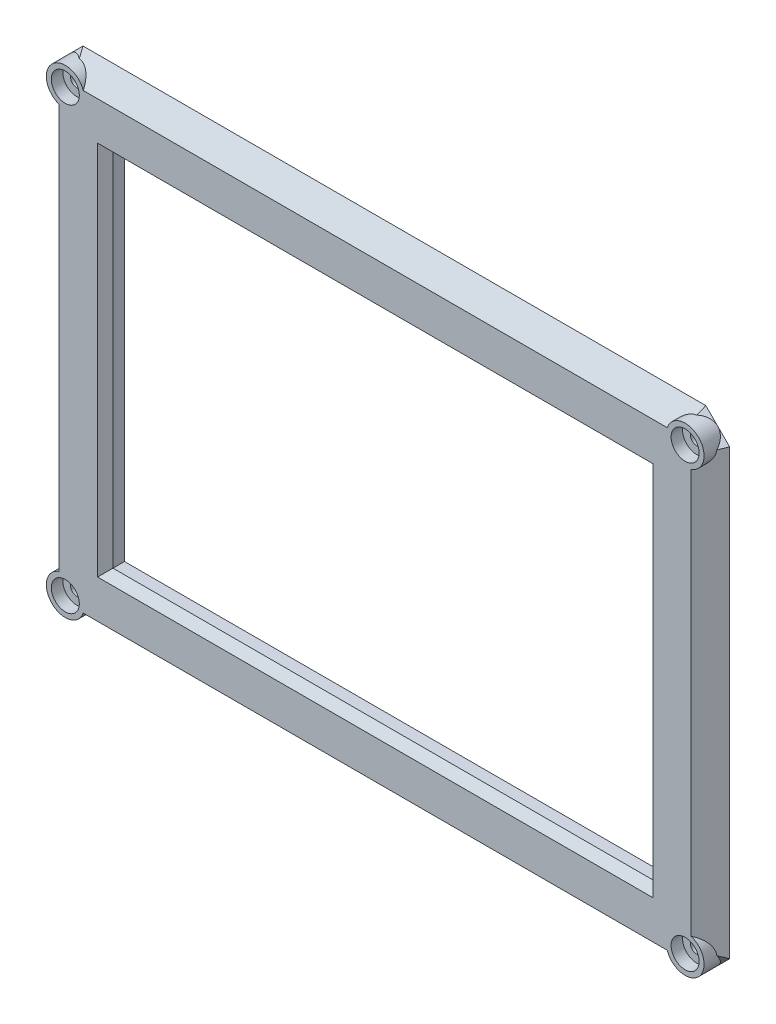
ISO-10303-21;
HEADER;
FILE_DESCRIPTION(('STEP AP214'),'2;1');
FILE_NAME('part.step','',(''),(''),'','','');
FILE_SCHEMA(('AUTOMOTIVE_DESIGN { 1 0 10303 214 1 1 1 1 }'));
ENDSEC;
DATA;
#1=APPLICATION_CONTEXT('core data for automotive mechanical design processes');
#2=APPLICATION_PROTOCOL_DEFINITION('international standard','automotive_design',2000,#1);
#3=PRODUCT_CONTEXT('',#1,'mechanical');
#4=PRODUCT('Part','Part','',(#3));
#5=PRODUCT_RELATED_PRODUCT_CATEGORY('part','',(#4));
#6=PRODUCT_DEFINITION_FORMATION('','',#4);
#7=PRODUCT_DEFINITION_CONTEXT('part definition',#1,'design');
#8=PRODUCT_DEFINITION('design','',#6,#7);
#9=PRODUCT_DEFINITION_SHAPE('','',#8);
#10=(LENGTH_UNIT() NAMED_UNIT(*) SI_UNIT(.MILLI.,.METRE.));
#11=(NAMED_UNIT(*) PLANE_ANGLE_UNIT() SI_UNIT($,.RADIAN.));
#12=(NAMED_UNIT(*) SI_UNIT($,.STERADIAN.) SOLID_ANGLE_UNIT());
#13=UNCERTAINTY_MEASURE_WITH_UNIT(LENGTH_MEASURE(1.E-05),#10,'distance_accuracy_value','');
#14=(GEOMETRIC_REPRESENTATION_CONTEXT(3) GLOBAL_UNCERTAINTY_ASSIGNED_CONTEXT((#13)) GLOBAL_UNIT_ASSIGNED_CONTEXT((#10,
#11,#12)) REPRESENTATION_CONTEXT('',''));
#15=CARTESIAN_POINT('',(0.,0.,0.));
#16=DIRECTION('',(0.,0.,1.));
#17=DIRECTION('',(1.,0.,0.));
#18=AXIS2_PLACEMENT_3D('',#15,#16,#17);
#19=CARTESIAN_POINT('',(3.70000000000048,110.900000000006,-10.));
#20=DIRECTION('',(0.,0.,1.));
#21=DIRECTION('',(1.,0.,0.));
#22=AXIS2_PLACEMENT_3D('',#19,#20,#21);
#23=CYLINDRICAL_SURFACE('',#22,1.65000000000002);
#24=CARTESIAN_POINT('',(3.70000000000048,110.900000000006,0.));
#25=DIRECTION('',(0.,0.,1.));
#26=DIRECTION('',(1.,0.,0.));
#27=AXIS2_PLACEMENT_3D('',#24,#25,#26);
#28=CIRCLE('',#27,1.65000000000002);
#29=CARTESIAN_POINT('',(5.3500000000005,110.900000000006,0.));
#30=VERTEX_POINT('',#29);
#31=EDGE_CURVE('E497',#30,#30,#28,.T.);
#32=ORIENTED_EDGE('',*,*,#31,.F.);
#33=EDGE_LOOP('',(#32));
#34=FACE_BOUND('',#33,.T.);
#35=CARTESIAN_POINT('',(3.70000000000048,110.900000000006,2.));
#36=DIRECTION('',(0.,0.,1.));
#37=DIRECTION('',(-1.,0.,0.));
#38=AXIS2_PLACEMENT_3D('',#35,#36,#37);
#39=CIRCLE('',#38,1.65000000000002);
#40=CARTESIAN_POINT('',(2.05000000000046,110.900000000006,2.));
#41=VERTEX_POINT('',#40);
#42=EDGE_CURVE('E535',#41,#41,#39,.T.);
#43=ORIENTED_EDGE('',*,*,#42,.T.);
#44=EDGE_LOOP('',(#43));
#45=FACE_BOUND('',#44,.T.);
#46=ADVANCED_FACE('F49',(#34,#45),#23,.F.);
#47=CARTESIAN_POINT('',(0.,0.,5.));
#48=DIRECTION('',(0.,0.,1.));
#49=DIRECTION('',(1.,0.,0.));
#50=AXIS2_PLACEMENT_3D('',#47,#48,#49);
#51=PLANE('',#50);
#52=CARTESIAN_POINT('',(3.70000000000048,110.900000000006,5.));
#53=DIRECTION('',(0.,0.,1.));
#54=DIRECTION('',(-1.,0.,0.));
#55=AXIS2_PLACEMENT_3D('',#52,#53,#54);
#56=CIRCLE('',#55,3.64999999999998);
#57=CARTESIAN_POINT('',(0.0500000000004967,110.900000000006,5.));
#58=VERTEX_POINT('',#57);
#59=EDGE_CURVE('E621',#58,#58,#56,.T.);
#60=ORIENTED_EDGE('',*,*,#59,.F.);
#61=EDGE_LOOP('',(#60));
#62=FACE_BOUND('',#61,.T.);
#63=CARTESIAN_POINT('',(-157.600000000001,110.900000000006,5.));
#64=DIRECTION('',(0.,0.,-1.));
#65=DIRECTION('',(1.,0.,0.));
#66=AXIS2_PLACEMENT_3D('',#63,#64,#65);
#67=CIRCLE('',#66,3.64999999999998);
#68=CARTESIAN_POINT('',(-153.950000000001,110.900000000006,5.));
#69=VERTEX_POINT('',#68);
#70=EDGE_CURVE('E551',#69,#69,#67,.T.);
#71=ORIENTED_EDGE('',*,*,#70,.T.);
#72=EDGE_LOOP('',(#71));
#73=FACE_BOUND('',#72,.T.);
#74=CARTESIAN_POINT('',(3.70000000000048,110.900000000006,5.));
#75=DIRECTION('',(0.,0.,1.));
#76=DIRECTION('',(-1.,0.,0.));
#77=AXIS2_PLACEMENT_3D('',#74,#75,#76);
#78=CIRCLE('',#77,4.93235959663517);
#79=CARTESIAN_POINT('',(5.28770491803324,106.23016442648,5.));
#80=VERTEX_POINT('',#79);
#81=CARTESIAN_POINT('',(-0.969835573525729,112.48770491804,5.));
#82=VERTEX_POINT('',#81);
#83=EDGE_CURVE('E188',#80,#82,#78,.T.);
#84=ORIENTED_EDGE('',*,*,#83,.T.);
#85=DIRECTION('',(-1.,0.,0.));
#86=VECTOR('',#85,1.);
#87=CARTESIAN_POINT('',(-157.987704918033,112.487704918031,5.));
#88=LINE('',#87,#86);
#89=CARTESIAN_POINT('',(-152.930164426474,112.48770491804,5.));
#90=VERTEX_POINT('',#89);
#91=EDGE_CURVE('E306',#82,#90,#88,.T.);
#92=ORIENTED_EDGE('',*,*,#91,.T.);
#93=CARTESIAN_POINT('',(-157.600000000001,110.900000000006,5.));
#94=DIRECTION('',(0.,0.,-1.));
#95=DIRECTION('',(1.,0.,0.));
#96=AXIS2_PLACEMENT_3D('',#93,#94,#95);
#97=CIRCLE('',#96,4.93235959663517);
#98=CARTESIAN_POINT('',(-159.187704918033,106.23016442648,5.));
#99=VERTEX_POINT('',#98);
#100=EDGE_CURVE('E344',#99,#90,#97,.T.);
#101=ORIENTED_EDGE('',*,*,#100,.F.);
#102=DIRECTION('',(0.,-1.,0.));
#103=VECTOR('',#102,1.);
#104=CARTESIAN_POINT('',(-159.187704918033,-4.08770491804433,5.));
#105=LINE('',#104,#103);
#106=CARTESIAN_POINT('',(-159.187704918033,0.969835573516212,5.));
#107=VERTEX_POINT('',#106);
#108=EDGE_CURVE('E220',#99,#107,#105,.T.);
#109=ORIENTED_EDGE('',*,*,#108,.T.);
#110=CARTESIAN_POINT('',(-157.600000000001,-3.7000000000103,5.));
#111=DIRECTION('',(0.,0.,1.));
#112=DIRECTION('',(1.,0.,0.));
#113=AXIS2_PLACEMENT_3D('',#110,#111,#112);
#114=CIRCLE('',#113,4.93235959663517);
#115=CARTESIAN_POINT('',(-152.930164426474,-5.28770491804395,5.));
#116=VERTEX_POINT('',#115);
#117=EDGE_CURVE('E341',#107,#116,#114,.T.);
#118=ORIENTED_EDGE('',*,*,#117,.T.);
#119=DIRECTION('',(1.,0.,0.));
#120=VECTOR('',#119,1.);
#121=CARTESIAN_POINT('',(4.08770491803245,-5.28770491803352,5.));
#122=LINE('',#121,#120);
#123=CARTESIAN_POINT('',(-0.969835573525674,-5.28770491804386,5.));
#124=VERTEX_POINT('',#123);
#125=EDGE_CURVE('E213',#116,#124,#122,.T.);
#126=ORIENTED_EDGE('',*,*,#125,.T.);
#127=CARTESIAN_POINT('',(3.70000000000054,-3.70000000001021,5.));
#128=DIRECTION('',(0.,0.,-1.));
#129=DIRECTION('',(-1.,0.,0.));
#130=AXIS2_PLACEMENT_3D('',#127,#128,#129);
#131=CIRCLE('',#130,4.93235959663517);
#132=CARTESIAN_POINT('',(5.28770491803278,0.969835573516306,5.));
#133=VERTEX_POINT('',#132);
#134=EDGE_CURVE('E66',#133,#124,#131,.T.);
#135=ORIENTED_EDGE('',*,*,#134,.F.);
#136=DIRECTION('',(0.,1.,0.));
#137=VECTOR('',#136,1.);
#138=CARTESIAN_POINT('',(5.28770491803268,111.287704918031,5.));
#139=LINE('',#138,#137);
#140=EDGE_CURVE('E204',#133,#80,#139,.T.);
#141=ORIENTED_EDGE('',*,*,#140,.T.);
#142=EDGE_LOOP('',(#84,#92,#101,#109,#118,#126,#135,#141));
#143=FACE_BOUND('',#142,.T.);
#144=CARTESIAN_POINT('',(-157.600000000001,-3.7000000000103,5.));
#145=DIRECTION('',(0.,0.,1.));
#146=DIRECTION('',(1.,0.,0.));
#147=AXIS2_PLACEMENT_3D('',#144,#145,#146);
#148=CIRCLE('',#147,3.64999999999998);
#149=CARTESIAN_POINT('',(-153.950000000001,-3.7000000000103,5.));
#150=VERTEX_POINT('',#149);
#151=EDGE_CURVE('E514',#150,#150,#148,.T.);
#152=ORIENTED_EDGE('',*,*,#151,.F.);
#153=EDGE_LOOP('',(#152));
#154=FACE_BOUND('',#153,.T.);
#155=DIRECTION('',(0.,-1.,0.));
#156=VECTOR('',#155,1.);
#157=CARTESIAN_POINT('',(-4.70000000000002,0.,5.));
#158=LINE('',#157,#156);
#159=CARTESIAN_POINT('',(-4.70000000000008,102.499999999998,5.));
#160=VERTEX_POINT('',#159);
#161=CARTESIAN_POINT('',(-4.70000000000002,4.69999999999803,5.));
#162=VERTEX_POINT('',#161);
#163=EDGE_CURVE('E260',#160,#162,#158,.T.);
#164=ORIENTED_EDGE('',*,*,#163,.T.);
#165=DIRECTION('',(-1.,0.,0.));
#166=VECTOR('',#165,1.);
#167=CARTESIAN_POINT('',(0.,4.69999999999803,5.));
#168=LINE('',#167,#166);
#169=CARTESIAN_POINT('',(-149.2,4.69999999999796,5.));
#170=VERTEX_POINT('',#169);
#171=EDGE_CURVE('E263',#162,#170,#168,.T.);
#172=ORIENTED_EDGE('',*,*,#171,.T.);
#173=DIRECTION('',(0.,1.,0.));
#174=VECTOR('',#173,1.);
#175=CARTESIAN_POINT('',(-149.2,0.,5.));
#176=LINE('',#175,#174);
#177=CARTESIAN_POINT('',(-149.2,102.499999999998,5.));
#178=VERTEX_POINT('',#177);
#179=EDGE_CURVE('E257',#170,#178,#176,.T.);
#180=ORIENTED_EDGE('',*,*,#179,.T.);
#181=DIRECTION('',(1.,0.,0.));
#182=VECTOR('',#181,1.);
#183=CARTESIAN_POINT('',(0.,102.499999999998,5.));
#184=LINE('',#183,#182);
#185=EDGE_CURVE('E218',#178,#160,#184,.T.);
#186=ORIENTED_EDGE('',*,*,#185,.T.);
#187=EDGE_LOOP('',(#164,#172,#180,#186));
#188=FACE_BOUND('',#187,.T.);
#189=CARTESIAN_POINT('',(3.70000000000054,-3.70000000001021,5.));
#190=DIRECTION('',(0.,0.,-1.));
#191=DIRECTION('',(-1.,0.,0.));
#192=AXIS2_PLACEMENT_3D('',#189,#190,#191);
#193=CIRCLE('',#192,3.64999999999998);
#194=CARTESIAN_POINT('',(0.0500000000005522,-3.70000000001021,5.));
#195=VERTEX_POINT('',#194);
#196=EDGE_CURVE('E531',#195,#195,#193,.T.);
#197=ORIENTED_EDGE('',*,*,#196,.T.);
#198=EDGE_LOOP('',(#197));
#199=FACE_BOUND('',#198,.T.);
#200=ADVANCED_FACE('F209',(#62,#73,#143,#154,#188,#199),#51,.T.);
#201=CARTESIAN_POINT('',(3.70000000000054,-3.70000000001021,-10.));
#202=DIRECTION('',(0.,0.,1.));
#203=DIRECTION('',(1.,0.,0.));
#204=AXIS2_PLACEMENT_3D('',#201,#202,#203);
#205=CYLINDRICAL_SURFACE('',#204,1.65000000000002);
#206=CARTESIAN_POINT('',(3.70000000000054,-3.70000000001021,0.));
#207=DIRECTION('',(0.,0.,1.));
#208=DIRECTION('',(1.,0.,0.));
#209=AXIS2_PLACEMENT_3D('',#206,#207,#208);
#210=CIRCLE('',#209,1.65000000000002);
#211=CARTESIAN_POINT('',(5.35000000000055,-3.70000000001021,0.));
#212=VERTEX_POINT('',#211);
#213=EDGE_CURVE('E499',#212,#212,#210,.F.);
#214=ORIENTED_EDGE('',*,*,#213,.T.);
#215=EDGE_LOOP('',(#214));
#216=FACE_BOUND('',#215,.T.);
#217=CARTESIAN_POINT('',(3.70000000000054,-3.70000000001021,2.));
#218=DIRECTION('',(0.,0.,-1.));
#219=DIRECTION('',(-1.,0.,0.));
#220=AXIS2_PLACEMENT_3D('',#217,#218,#219);
#221=CIRCLE('',#220,1.65000000000002);
#222=CARTESIAN_POINT('',(2.05000000000052,-3.70000000001021,2.));
#223=VERTEX_POINT('',#222);
#224=EDGE_CURVE('E540',#223,#223,#221,.T.);
#225=ORIENTED_EDGE('',*,*,#224,.F.);
#226=EDGE_LOOP('',(#225));
#227=FACE_BOUND('',#226,.T.);
#228=ADVANCED_FACE('F435',(#216,#227),#205,.F.);
#229=CARTESIAN_POINT('',(-157.600000000001,110.900000000006,-10.));
#230=DIRECTION('',(0.,0.,1.));
#231=DIRECTION('',(1.,0.,0.));
#232=AXIS2_PLACEMENT_3D('',#229,#230,#231);
#233=CYLINDRICAL_SURFACE('',#232,1.65000000000002);
#234=CARTESIAN_POINT('',(-157.600000000001,110.900000000006,0.));
#235=DIRECTION('',(0.,0.,1.));
#236=DIRECTION('',(1.,0.,0.));
#237=AXIS2_PLACEMENT_3D('',#234,#235,#236);
#238=CIRCLE('',#237,1.65000000000002);
#239=CARTESIAN_POINT('',(-155.950000000001,110.900000000006,0.));
#240=VERTEX_POINT('',#239);
#241=EDGE_CURVE('E505',#240,#240,#238,.F.);
#242=ORIENTED_EDGE('',*,*,#241,.T.);
#243=EDGE_LOOP('',(#242));
#244=FACE_BOUND('',#243,.T.);
#245=CARTESIAN_POINT('',(-157.600000000001,110.900000000006,2.));
#246=DIRECTION('',(0.,0.,-1.));
#247=DIRECTION('',(1.,0.,0.));
#248=AXIS2_PLACEMENT_3D('',#245,#246,#247);
#249=CIRCLE('',#248,1.65000000000002);
#250=CARTESIAN_POINT('',(-155.950000000001,110.900000000006,2.));
#251=VERTEX_POINT('',#250);
#252=EDGE_CURVE('E197',#251,#251,#249,.T.);
#253=ORIENTED_EDGE('',*,*,#252,.F.);
#254=EDGE_LOOP('',(#253));
#255=FACE_BOUND('',#254,.T.);
#256=ADVANCED_FACE('F426',(#244,#255),#233,.F.);
#257=CARTESIAN_POINT('',(57.252171012099,57.252171012099,5.));
#258=DIRECTION('',(0.5,0.5,0.707106781186547));
#259=DIRECTION('',(0.707106781186548,-0.707106781186547,0.));
#260=AXIS2_PLACEMENT_3D('',#257,#258,#259);
#261=PLANE('',#260);
#262=CARTESIAN_POINT('',(3.70000000000048,110.900000000006,4.932359596631));
#263=DIRECTION('',(0.5,0.5,0.707106781186547));
#264=DIRECTION('',(-0.5,-0.5,0.707106781186548));
#265=AXIS2_PLACEMENT_3D('',#262,#263,#264);
#266=ELLIPSE('',#265,6.97540983606255,4.93235959663517);
#267=CARTESIAN_POINT('',(8.62311835540782,110.598210588048,1.66458656262487));
#268=VERTEX_POINT('',#267);
#269=CARTESIAN_POINT('',(7.18770491802879,114.387704918035,0.));
#270=VERTEX_POINT('',#269);
#271=EDGE_CURVE('E11',#268,#270,#266,.T.);
#272=ORIENTED_EDGE('',*,*,#271,.F.);
#273=DIRECTION('',(-0.678598344545847,-0.28108463771482,0.678598344545848));
#274=VECTOR('',#273,1.);
#275=CARTESIAN_POINT('',(-15.5446663284845,100.587586399467,25.8323712465172));
#276=LINE('',#275,#274);
#277=CARTESIAN_POINT('',(10.2877049180327,111.287704918031,0.));
#278=VERTEX_POINT('',#277);
#279=EDGE_CURVE('E206',#268,#278,#276,.F.);
#280=ORIENTED_EDGE('',*,*,#279,.T.);
#281=DIRECTION('',(-0.707106781186548,0.707106781186547,0.));
#282=VECTOR('',#281,1.);
#283=CARTESIAN_POINT('',(10.2877049180327,111.287704918031,0.));
#284=LINE('',#283,#282);
#285=EDGE_CURVE('E316',#278,#270,#284,.T.);
#286=ORIENTED_EDGE('',*,*,#285,.T.);
#287=EDGE_LOOP('',(#272,#280,#286));
#288=FACE_BOUND('',#287,.T.);
#289=ADVANCED_FACE('F423',(#288),#261,.T.);
#290=CARTESIAN_POINT('',(3.65217101210042,-3.65217101210041,5.));
#291=DIRECTION('',(0.5,-0.5,0.707106781186547));
#292=DIRECTION('',(-0.707106781186547,-0.707106781186548,0.));
#293=AXIS2_PLACEMENT_3D('',#290,#291,#292);
#294=PLANE('',#293);
#295=DIRECTION('',(-0.678598344545847,0.28108463771482,0.678598344545847));
#296=VECTOR('',#295,1.);
#297=CARTESIAN_POINT('',(4.8465161413208,-1.83389073128715,5.44118877671198));
#298=LINE('',#297,#296);
#299=CARTESIAN_POINT('',(8.6231183554078,-3.39821058805024,1.66458656262498));
#300=VERTEX_POINT('',#299);
#301=CARTESIAN_POINT('',(10.2877049180328,-4.08770491803352,0.));
#302=VERTEX_POINT('',#301);
#303=EDGE_CURVE('E235',#300,#302,#298,.F.);
#304=ORIENTED_EDGE('',*,*,#303,.F.);
#305=CARTESIAN_POINT('',(3.70000000000054,-3.70000000001021,4.93235959663023));
#306=DIRECTION('',(0.5,-0.5,0.707106781186547));
#307=DIRECTION('',(-0.5,0.5,0.707106781186548));
#308=AXIS2_PLACEMENT_3D('',#305,#306,#307);
#309=ELLIPSE('',#308,6.97540983606255,4.93235959663517);
#310=CARTESIAN_POINT('',(7.18770491803181,-7.18770491804148,0.));
#311=VERTEX_POINT('',#310);
#312=EDGE_CURVE('E560',#300,#311,#309,.F.);
#313=ORIENTED_EDGE('',*,*,#312,.T.);
#314=DIRECTION('',(0.707106781186547,0.707106781186548,0.));
#315=VECTOR('',#314,1.);
#316=CARTESIAN_POINT('',(4.08770491803279,-10.2877049180335,0.));
#317=LINE('',#316,#315);
#318=EDGE_CURVE('E415',#311,#302,#317,.T.);
#319=ORIENTED_EDGE('',*,*,#318,.T.);
#320=EDGE_LOOP('',(#304,#313,#319));
#321=FACE_BOUND('',#320,.T.);
#322=ADVANCED_FACE('F425',(#321),#294,.T.);
#323=CARTESIAN_POINT('',(4.08770491803279,-10.2877049180335,0.));
#324=VERTEX_POINT('',#323);
#325=EDGE_CURVE('E416',#324,#311,#317,.T.);
#326=ORIENTED_EDGE('',*,*,#325,.T.);
#327=CARTESIAN_POINT('',(3.39821058805348,-8.62311835541827,1.6645865626153));
#328=VERTEX_POINT('',#327);
#329=EDGE_CURVE('E564',#311,#328,#309,.F.);
#330=ORIENTED_EDGE('',*,*,#329,.T.);
#331=DIRECTION('',(-0.281084637714841,0.678598344545833,0.678598344545852));
#332=VECTOR('',#331,1.);
#333=CARTESIAN_POINT('',(1.85730548502224,-4.90304435735069,5.38466056068297));
#334=LINE('',#333,#332);
#335=EDGE_CURVE('E243',#328,#324,#334,.F.);
#336=ORIENTED_EDGE('',*,*,#335,.T.);
#337=EDGE_LOOP('',(#326,#330,#336));
#338=FACE_BOUND('',#337,.T.);
#339=ADVANCED_FACE('F432',(#338),#294,.T.);
#340=CARTESIAN_POINT('',(3.51343599918196E-13,-5.28770491803379,5.));
#341=DIRECTION('',(0.,-0.707106781186548,0.707106781186547));
#342=DIRECTION('',(-1.,0.,0.));
#343=AXIS2_PLACEMENT_3D('',#340,#341,#342);
#344=PLANE('',#343);
#345=ORIENTED_EDGE('',*,*,#335,.F.);
#346=CARTESIAN_POINT('',(3.70000000000054,-3.70000000001021,6.58770491802334));
#347=DIRECTION('',(0.,-0.707106781186548,0.707106781186547));
#348=DIRECTION('',(0.,0.707106781186547,0.707106781186548));
#349=AXIS2_PLACEMENT_3D('',#346,#347,#348);
#350=ELLIPSE('',#349,6.97540983606255,4.93235959663517);
#351=EDGE_CURVE('E565',#328,#124,#350,.F.);
#352=ORIENTED_EDGE('',*,*,#351,.T.);
#353=ORIENTED_EDGE('',*,*,#125,.F.);
#354=CARTESIAN_POINT('',(-157.600000000001,-3.7000000000103,6.58770491803396));
#355=DIRECTION('',(0.,-0.707106781186548,0.707106781186547));
#356=DIRECTION('',(0.,0.707106781186547,0.707106781186548));
#357=AXIS2_PLACEMENT_3D('',#354,#355,#356);
#358=ELLIPSE('',#357,6.97540983606255,4.93235959663517);
#359=CARTESIAN_POINT('',(-157.29821058805,-8.62311835541813,1.66458656262612));
#360=VERTEX_POINT('',#359);
#361=EDGE_CURVE('E352',#360,#116,#358,.T.);
#362=ORIENTED_EDGE('',*,*,#361,.F.);
#363=DIRECTION('',(0.281084637714799,0.678598344545861,0.678598344545842));
#364=VECTOR('',#363,1.);
#365=CARTESIAN_POINT('',(-164.331898694361,-25.6039435751792,-15.3162386571345));
#366=LINE('',#365,#364);
#367=CARTESIAN_POINT('',(-157.987704918033,-10.2877049180443,0.));
#368=VERTEX_POINT('',#367);
#369=EDGE_CURVE('E250',#360,#368,#366,.F.);
#370=ORIENTED_EDGE('',*,*,#369,.T.);
#371=DIRECTION('',(1.,0.,0.));
#372=VECTOR('',#371,1.);
#373=CARTESIAN_POINT('',(-157.987704918033,-10.2877049180443,0.));
#374=LINE('',#373,#372);
#375=EDGE_CURVE('E411',#368,#324,#374,.T.);
#376=ORIENTED_EDGE('',*,*,#375,.T.);
#377=EDGE_LOOP('',(#345,#352,#353,#362,#370,#376));
#378=FACE_BOUND('',#377,.T.);
#379=ADVANCED_FACE('F759',(#378),#344,.T.);
#380=CARTESIAN_POINT('',(5.28770491803278,0.,5.));
#381=DIRECTION('',(0.707106781186548,0.,0.707106781186547));
#382=DIRECTION('',(0.,-1.,0.));
#383=AXIS2_PLACEMENT_3D('',#380,#381,#382);
#384=PLANE('',#383);
#385=CARTESIAN_POINT('',(3.70000000000048,110.900000000006,6.5877049180322));
#386=DIRECTION('',(0.707106781186548,0.,0.707106781186547));
#387=DIRECTION('',(-0.707106781186547,0.,0.707106781186548));
#388=AXIS2_PLACEMENT_3D('',#385,#386,#387);
#389=ELLIPSE('',#388,6.97540983606255,4.93235959663517);
#390=EDGE_CURVE('E191',#80,#268,#389,.T.);
#391=ORIENTED_EDGE('',*,*,#390,.F.);
#392=ORIENTED_EDGE('',*,*,#140,.F.);
#393=CARTESIAN_POINT('',(3.70000000000054,-3.70000000001021,6.58770491803225));
#394=DIRECTION('',(0.707106781186548,0.,0.707106781186547));
#395=DIRECTION('',(-0.707106781186547,0.,0.707106781186548));
#396=AXIS2_PLACEMENT_3D('',#393,#394,#395);
#397=ELLIPSE('',#396,6.97540983606255,4.93235959663517);
#398=EDGE_CURVE('E295',#133,#300,#397,.F.);
#399=ORIENTED_EDGE('',*,*,#398,.T.);
#400=ORIENTED_EDGE('',*,*,#303,.T.);
#401=DIRECTION('',(0.,1.,0.));
#402=VECTOR('',#401,1.);
#403=CARTESIAN_POINT('',(10.2877049180328,-4.08770491803352,0.));
#404=LINE('',#403,#402);
#405=EDGE_CURVE('E317',#302,#278,#404,.T.);
#406=ORIENTED_EDGE('',*,*,#405,.T.);
#407=ORIENTED_EDGE('',*,*,#279,.F.);
#408=EDGE_LOOP('',(#391,#392,#399,#400,#406,#407));
#409=FACE_BOUND('',#408,.T.);
#410=ADVANCED_FACE('F202',(#409),#384,.T.);
#411=CARTESIAN_POINT('',(-134.202171012099,134.202171012099,5.));
#412=DIRECTION('',(-0.499999999999997,0.499999999999996,0.707106781186552));
#413=DIRECTION('',(0.707106781186547,0.707106781186548,0.));
#414=AXIS2_PLACEMENT_3D('',#411,#412,#413);
#415=PLANE('',#414);
#416=DIRECTION('',(0.678598344545845,-0.281084637714831,0.678598344545845));
#417=VECTOR('',#416,1.);
#418=CARTESIAN_POINT('',(-152.447803593169,106.42487856835,11.7399013248643));
#419=LINE('',#418,#417);
#420=CARTESIAN_POINT('',(-164.187704918033,111.287704918031,0.));
#421=VERTEX_POINT('',#420);
#422=CARTESIAN_POINT('',(-162.523118355408,110.598210588048,1.66458656262488));
#423=VERTEX_POINT('',#422);
#424=EDGE_CURVE('E239',#421,#423,#419,.T.);
#425=ORIENTED_EDGE('',*,*,#424,.T.);
#426=CARTESIAN_POINT('',(-157.600000000001,110.900000000006,4.93235959663103));
#427=DIRECTION('',(-0.499999999999997,0.499999999999996,0.707106781186552));
#428=DIRECTION('',(0.500000000000004,-0.500000000000003,0.707106781186543));
#429=AXIS2_PLACEMENT_3D('',#426,#427,#428);
#430=ELLIPSE('',#429,6.9754098360625,4.93235959663517);
#431=CARTESIAN_POINT('',(-161.087704918032,114.387704918037,0.));
#432=VERTEX_POINT('',#431);
#433=EDGE_CURVE('E507',#423,#432,#430,.F.);
#434=ORIENTED_EDGE('',*,*,#433,.T.);
#435=DIRECTION('',(-0.707106781186547,-0.707106781186548,0.));
#436=VECTOR('',#435,1.);
#437=CARTESIAN_POINT('',(-157.987704918033,117.487704918031,0.));
#438=LINE('',#437,#436);
#439=EDGE_CURVE('E327',#432,#421,#438,.T.);
#440=ORIENTED_EDGE('',*,*,#439,.T.);
#441=EDGE_LOOP('',(#425,#434,#440));
#442=FACE_BOUND('',#441,.T.);
#443=ADVANCED_FACE('F577',(#442),#415,.T.);
#444=CARTESIAN_POINT('',(-157.987704918033,117.487704918031,0.));
#445=VERTEX_POINT('',#444);
#446=EDGE_CURVE('E324',#445,#432,#438,.T.);
#447=ORIENTED_EDGE('',*,*,#446,.T.);
#448=CARTESIAN_POINT('',(-157.298210588053,115.823118355414,1.66458656261652));
#449=VERTEX_POINT('',#448);
#450=EDGE_CURVE('E570',#432,#449,#430,.F.);
#451=ORIENTED_EDGE('',*,*,#450,.T.);
#452=DIRECTION('',(-0.281084637714832,0.678598344545845,-0.678598344545844));
#453=VECTOR('',#452,1.);
#454=CARTESIAN_POINT('',(-158.342902894221,118.345228689471,-0.857523771440179));
#455=LINE('',#454,#453);
#456=EDGE_CURVE('E231',#445,#449,#455,.F.);
#457=ORIENTED_EDGE('',*,*,#456,.F.);
#458=EDGE_LOOP('',(#447,#451,#457));
#459=FACE_BOUND('',#458,.T.);
#460=ADVANCED_FACE('F579',(#459),#415,.T.);
#461=CARTESIAN_POINT('',(-159.187704918033,6.89317030117183E-13,5.));
#462=DIRECTION('',(-0.707106781186547,0.,0.707106781186548));
#463=DIRECTION('',(0.,1.,0.));
#464=AXIS2_PLACEMENT_3D('',#461,#462,#463);
#465=PLANE('',#464);
#466=ORIENTED_EDGE('',*,*,#108,.F.);
#467=CARTESIAN_POINT('',(-157.600000000001,110.900000000006,6.58770491803222));
#468=DIRECTION('',(-0.707106781186547,0.,0.707106781186548));
#469=DIRECTION('',(0.707106781186548,0.,0.707106781186547));
#470=AXIS2_PLACEMENT_3D('',#467,#468,#469);
#471=ELLIPSE('',#470,6.97540983606254,4.93235959663517);
#472=EDGE_CURVE('E500',#99,#423,#471,.F.);
#473=ORIENTED_EDGE('',*,*,#472,.T.);
#474=ORIENTED_EDGE('',*,*,#424,.F.);
#475=DIRECTION('',(0.,-1.,0.));
#476=VECTOR('',#475,1.);
#477=CARTESIAN_POINT('',(-164.187704918033,111.287704918031,0.));
#478=LINE('',#477,#476);
#479=CARTESIAN_POINT('',(-164.187704918033,-4.08770491804431,0.));
#480=VERTEX_POINT('',#479);
#481=EDGE_CURVE('E362',#421,#480,#478,.T.);
#482=ORIENTED_EDGE('',*,*,#481,.T.);
#483=DIRECTION('',(0.678598344545849,0.281084637714818,0.678598344545846));
#484=VECTOR('',#483,1.);
#485=CARTESIAN_POINT('',(-158.803044357348,-1.85730548503291,5.38466056068543));
#486=LINE('',#485,#484);
#487=CARTESIAN_POINT('',(-162.523118355408,-3.39821058806109,1.66458656262485));
#488=VERTEX_POINT('',#487);
#489=EDGE_CURVE('E246',#480,#488,#486,.T.);
#490=ORIENTED_EDGE('',*,*,#489,.T.);
#491=CARTESIAN_POINT('',(-157.600000000001,-3.7000000000103,6.58770491803277));
#492=DIRECTION('',(-0.707106781186547,0.,0.707106781186548));
#493=DIRECTION('',(0.707106781186548,0.,0.707106781186547));
#494=AXIS2_PLACEMENT_3D('',#491,#492,#493);
#495=ELLIPSE('',#494,6.97540983606254,4.93235959663517);
#496=EDGE_CURVE('E275',#107,#488,#495,.T.);
#497=ORIENTED_EDGE('',*,*,#496,.F.);
#498=EDGE_LOOP('',(#466,#473,#474,#482,#490,#497));
#499=FACE_BOUND('',#498,.T.);
#500=ADVANCED_FACE('F357',(#499),#465,.T.);
#501=CARTESIAN_POINT('',(0.,112.487704918031,5.));
#502=DIRECTION('',(0.,0.707106781186547,0.707106781186548));
#503=DIRECTION('',(1.,0.,0.));
#504=AXIS2_PLACEMENT_3D('',#501,#502,#503);
#505=PLANE('',#504);
#506=CARTESIAN_POINT('',(3.70000000000048,110.900000000006,6.58770491802443));
#507=DIRECTION('',(0.,0.707106781186547,0.707106781186548));
#508=DIRECTION('',(0.,-0.707106781186548,0.707106781186547));
#509=AXIS2_PLACEMENT_3D('',#506,#507,#508);
#510=ELLIPSE('',#509,6.97540983606255,4.93235959663517);
#511=CARTESIAN_POINT('',(3.39821058805296,115.823118355414,1.6645865626164));
#512=VERTEX_POINT('',#511);
#513=EDGE_CURVE('E194',#512,#82,#510,.T.);
#514=ORIENTED_EDGE('',*,*,#513,.F.);
#515=DIRECTION('',(0.281084637714819,0.678598344545847,-0.678598344545847));
#516=VECTOR('',#515,1.);
#517=CARTESIAN_POINT('',(1.85730548502225,112.103044357348,5.38466056068307));
#518=LINE('',#517,#516);
#519=CARTESIAN_POINT('',(4.08770491803268,117.487704918031,0.));
#520=VERTEX_POINT('',#519);
#521=EDGE_CURVE('E224',#520,#512,#518,.F.);
#522=ORIENTED_EDGE('',*,*,#521,.F.);
#523=DIRECTION('',(-1.,0.,0.));
#524=VECTOR('',#523,1.);
#525=CARTESIAN_POINT('',(4.08770491803268,117.487704918031,0.));
#526=LINE('',#525,#524);
#527=EDGE_CURVE('E319',#520,#445,#526,.T.);
#528=ORIENTED_EDGE('',*,*,#527,.T.);
#529=ORIENTED_EDGE('',*,*,#456,.T.);
#530=CARTESIAN_POINT('',(-157.600000000001,110.900000000006,6.58770491802454));
#531=DIRECTION('',(0.,0.707106781186547,0.707106781186548));
#532=DIRECTION('',(0.,-0.707106781186548,0.707106781186547));
#533=AXIS2_PLACEMENT_3D('',#530,#531,#532);
#534=ELLIPSE('',#533,6.97540983606255,4.93235959663517);
#535=EDGE_CURVE('E292',#449,#90,#534,.F.);
#536=ORIENTED_EDGE('',*,*,#535,.T.);
#537=ORIENTED_EDGE('',*,*,#91,.F.);
#538=EDGE_LOOP('',(#514,#522,#528,#529,#536,#537));
#539=FACE_BOUND('',#538,.T.);
#540=ADVANCED_FACE('F304',(#539),#505,.T.);
#541=CARTESIAN_POINT('',(-157.600000000001,-3.7000000000103,-10.));
#542=DIRECTION('',(0.,0.,1.));
#543=DIRECTION('',(1.,0.,0.));
#544=AXIS2_PLACEMENT_3D('',#541,#542,#543);
#545=CYLINDRICAL_SURFACE('',#544,1.65000000000002);
#546=CARTESIAN_POINT('',(-157.600000000001,-3.7000000000103,0.));
#547=DIRECTION('',(0.,0.,1.));
#548=DIRECTION('',(1.,0.,0.));
#549=AXIS2_PLACEMENT_3D('',#546,#547,#548);
#550=CIRCLE('',#549,1.65000000000002);
#551=CARTESIAN_POINT('',(-155.950000000001,-3.7000000000103,0.));
#552=VERTEX_POINT('',#551);
#553=EDGE_CURVE('E280',#552,#552,#550,.T.);
#554=ORIENTED_EDGE('',*,*,#553,.F.);
#555=EDGE_LOOP('',(#554));
#556=FACE_BOUND('',#555,.T.);
#557=CARTESIAN_POINT('',(-157.600000000001,-3.7000000000103,2.));
#558=DIRECTION('',(0.,0.,1.));
#559=DIRECTION('',(1.,0.,0.));
#560=AXIS2_PLACEMENT_3D('',#557,#558,#559);
#561=CIRCLE('',#560,1.65000000000002);
#562=CARTESIAN_POINT('',(-155.950000000001,-3.7000000000103,2.));
#563=VERTEX_POINT('',#562);
#564=EDGE_CURVE('E355',#563,#563,#561,.T.);
#565=ORIENTED_EDGE('',*,*,#564,.T.);
#566=EDGE_LOOP('',(#565));
#567=FACE_BOUND('',#566,.T.);
#568=ADVANCED_FACE('F471',(#556,#567),#545,.F.);
#569=CARTESIAN_POINT('',(-80.6021710121057,-80.6021710121061,5.));
#570=DIRECTION('',(-0.499999999999999,-0.500000000000001,0.707106781186547));
#571=DIRECTION('',(-0.707106781186549,0.707106781186546,0.));
#572=AXIS2_PLACEMENT_3D('',#569,#570,#571);
#573=PLANE('',#572);
#574=CARTESIAN_POINT('',(-157.600000000001,-3.7000000000103,4.93235959663817));
#575=DIRECTION('',(-0.499999999999999,-0.500000000000001,0.707106781186547));
#576=DIRECTION('',(0.499999999999999,0.500000000000001,0.707106781186548));
#577=AXIS2_PLACEMENT_3D('',#574,#575,#576);
#578=ELLIPSE('',#577,6.97540983606255,4.93235959663517);
#579=CARTESIAN_POINT('',(-161.087704918034,-7.1877049180437,0.));
#580=VERTEX_POINT('',#579);
#581=EDGE_CURVE('E354',#488,#580,#578,.T.);
#582=ORIENTED_EDGE('',*,*,#581,.F.);
#583=ORIENTED_EDGE('',*,*,#489,.F.);
#584=DIRECTION('',(0.707106781186549,-0.707106781186546,0.));
#585=VECTOR('',#584,1.);
#586=CARTESIAN_POINT('',(-164.187704918033,-4.08770491804431,0.));
#587=LINE('',#586,#585);
#588=EDGE_CURVE('E366',#480,#580,#587,.T.);
#589=ORIENTED_EDGE('',*,*,#588,.T.);
#590=EDGE_LOOP('',(#582,#583,#589));
#591=FACE_BOUND('',#590,.T.);
#592=ADVANCED_FACE('F365',(#591),#573,.T.);
#593=CARTESIAN_POINT('',(0.,0.,0.));
#594=DIRECTION('',(0.,0.,1.));
#595=DIRECTION('',(1.,0.,0.));
#596=AXIS2_PLACEMENT_3D('',#593,#594,#595);
#597=PLANE('',#596);
#598=ORIENTED_EDGE('',*,*,#31,.T.);
#599=EDGE_LOOP('',(#598));
#600=FACE_BOUND('',#599,.T.);
#601=EDGE_CURVE('E310',#270,#520,#284,.T.);
#602=ORIENTED_EDGE('',*,*,#601,.F.);
#603=ORIENTED_EDGE('',*,*,#285,.F.);
#604=ORIENTED_EDGE('',*,*,#405,.F.);
#605=ORIENTED_EDGE('',*,*,#318,.F.);
#606=ORIENTED_EDGE('',*,*,#325,.F.);
#607=ORIENTED_EDGE('',*,*,#375,.F.);
#608=EDGE_CURVE('E408',#580,#368,#587,.T.);
#609=ORIENTED_EDGE('',*,*,#608,.F.);
#610=ORIENTED_EDGE('',*,*,#588,.F.);
#611=ORIENTED_EDGE('',*,*,#481,.F.);
#612=ORIENTED_EDGE('',*,*,#439,.F.);
#613=ORIENTED_EDGE('',*,*,#446,.F.);
#614=ORIENTED_EDGE('',*,*,#527,.F.);
#615=EDGE_LOOP('',(#602,#603,#604,#605,#606,#607,#609,#610,#611,#612,#613,#614));
#616=FACE_BOUND('',#615,.T.);
#617=DIRECTION('',(0.,1.,0.));
#618=VECTOR('',#617,1.);
#619=CARTESIAN_POINT('',(-6.70000000000002,6.69999999999803,0.));
#620=LINE('',#619,#618);
#621=CARTESIAN_POINT('',(-6.70000000000002,6.69999999999803,0.));
#622=VERTEX_POINT('',#621);
#623=CARTESIAN_POINT('',(-6.70000000000008,100.499999999998,0.));
#624=VERTEX_POINT('',#623);
#625=EDGE_CURVE('E253',#622,#624,#620,.T.);
#626=ORIENTED_EDGE('',*,*,#625,.T.);
#627=DIRECTION('',(-1.,0.,0.));
#628=VECTOR('',#627,1.);
#629=CARTESIAN_POINT('',(-6.70000000000008,100.499999999998,0.));
#630=LINE('',#629,#628);
#631=CARTESIAN_POINT('',(-147.2,100.499999999998,0.));
#632=VERTEX_POINT('',#631);
#633=EDGE_CURVE('E382',#624,#632,#630,.T.);
#634=ORIENTED_EDGE('',*,*,#633,.T.);
#635=DIRECTION('',(0.,-1.,0.));
#636=VECTOR('',#635,1.);
#637=CARTESIAN_POINT('',(-147.2,100.499999999998,0.));
#638=LINE('',#637,#636);
#639=CARTESIAN_POINT('',(-147.2,6.69999999999796,0.));
#640=VERTEX_POINT('',#639);
#641=EDGE_CURVE('E386',#632,#640,#638,.T.);
#642=ORIENTED_EDGE('',*,*,#641,.T.);
#643=DIRECTION('',(1.,0.,0.));
#644=VECTOR('',#643,1.);
#645=CARTESIAN_POINT('',(-147.2,6.69999999999796,0.));
#646=LINE('',#645,#644);
#647=EDGE_CURVE('E390',#640,#622,#646,.T.);
#648=ORIENTED_EDGE('',*,*,#647,.T.);
#649=EDGE_LOOP('',(#626,#634,#642,#648));
#650=FACE_BOUND('',#649,.T.);
#651=ORIENTED_EDGE('',*,*,#553,.T.);
#652=EDGE_LOOP('',(#651));
#653=FACE_BOUND('',#652,.T.);
#654=ORIENTED_EDGE('',*,*,#241,.F.);
#655=EDGE_LOOP('',(#654));
#656=FACE_BOUND('',#655,.T.);
#657=ORIENTED_EDGE('',*,*,#213,.F.);
#658=EDGE_LOOP('',(#657));
#659=FACE_BOUND('',#658,.T.);
#660=ADVANCED_FACE('F320',(#600,#616,#650,#653,#656,#659),#597,.F.);
#661=CARTESIAN_POINT('',(-6.70000000000002,6.69999999999803,5.));
#662=DIRECTION('',(-1.,0.,0.));
#663=DIRECTION('',(0.,-1.,0.));
#664=AXIS2_PLACEMENT_3D('',#661,#662,#663);
#665=PLANE('',#664);
#666=DIRECTION('',(0.,0.,-1.));
#667=VECTOR('',#666,1.);
#668=CARTESIAN_POINT('',(-6.70000000000002,6.69999999999803,5.));
#669=LINE('',#668,#667);
#670=CARTESIAN_POINT('',(-6.70000000000002,6.69999999999803,3.));
#671=VERTEX_POINT('',#670);
#672=EDGE_CURVE('E394',#671,#622,#669,.T.);
#673=ORIENTED_EDGE('',*,*,#672,.F.);
#674=DIRECTION('',(0.,1.,0.));
#675=VECTOR('',#674,1.);
#676=CARTESIAN_POINT('',(-6.70000000000002,6.69999999999803,3.));
#677=LINE('',#676,#675);
#678=CARTESIAN_POINT('',(-6.70000000000008,100.499999999998,3.));
#679=VERTEX_POINT('',#678);
#680=EDGE_CURVE('E267',#671,#679,#677,.T.);
#681=ORIENTED_EDGE('',*,*,#680,.T.);
#682=DIRECTION('',(0.,0.,-1.));
#683=VECTOR('',#682,1.);
#684=CARTESIAN_POINT('',(-6.70000000000008,100.499999999998,5.));
#685=LINE('',#684,#683);
#686=EDGE_CURVE('E403',#679,#624,#685,.T.);
#687=ORIENTED_EDGE('',*,*,#686,.T.);
#688=ORIENTED_EDGE('',*,*,#625,.F.);
#689=EDGE_LOOP('',(#673,#681,#687,#688));
#690=FACE_BOUND('',#689,.T.);
#691=ADVANCED_FACE('F486',(#690),#665,.T.);
#692=CARTESIAN_POINT('',(-6.70000000000008,100.499999999998,5.));
#693=DIRECTION('',(0.,-1.,0.));
#694=DIRECTION('',(1.,0.,0.));
#695=AXIS2_PLACEMENT_3D('',#692,#693,#694);
#696=PLANE('',#695);
#697=ORIENTED_EDGE('',*,*,#686,.F.);
#698=DIRECTION('',(-1.,0.,0.));
#699=VECTOR('',#698,1.);
#700=CARTESIAN_POINT('',(-6.70000000000008,100.499999999998,3.));
#701=LINE('',#700,#699);
#702=CARTESIAN_POINT('',(-147.2,100.499999999998,3.));
#703=VERTEX_POINT('',#702);
#704=EDGE_CURVE('E74',#679,#703,#701,.T.);
#705=ORIENTED_EDGE('',*,*,#704,.T.);
#706=DIRECTION('',(0.,0.,-1.));
#707=VECTOR('',#706,1.);
#708=CARTESIAN_POINT('',(-147.2,100.499999999998,5.));
#709=LINE('',#708,#707);
#710=EDGE_CURVE('E400',#703,#632,#709,.T.);
#711=ORIENTED_EDGE('',*,*,#710,.T.);
#712=ORIENTED_EDGE('',*,*,#633,.F.);
#713=EDGE_LOOP('',(#697,#705,#711,#712));
#714=FACE_BOUND('',#713,.T.);
#715=ADVANCED_FACE('F482',(#714),#696,.T.);
#716=CARTESIAN_POINT('',(-147.2,100.499999999998,5.));
#717=DIRECTION('',(1.,0.,0.));
#718=DIRECTION('',(0.,1.,0.));
#719=AXIS2_PLACEMENT_3D('',#716,#717,#718);
#720=PLANE('',#719);
#721=ORIENTED_EDGE('',*,*,#710,.F.);
#722=DIRECTION('',(0.,-1.,0.));
#723=VECTOR('',#722,1.);
#724=CARTESIAN_POINT('',(-147.2,100.499999999998,3.));
#725=LINE('',#724,#723);
#726=CARTESIAN_POINT('',(-147.2,6.69999999999796,3.));
#727=VERTEX_POINT('',#726);
#728=EDGE_CURVE('E270',#703,#727,#725,.T.);
#729=ORIENTED_EDGE('',*,*,#728,.T.);
#730=DIRECTION('',(0.,0.,-1.));
#731=VECTOR('',#730,1.);
#732=CARTESIAN_POINT('',(-147.2,6.69999999999796,5.));
#733=LINE('',#732,#731);
#734=EDGE_CURVE('E397',#727,#640,#733,.T.);
#735=ORIENTED_EDGE('',*,*,#734,.T.);
#736=ORIENTED_EDGE('',*,*,#641,.F.);
#737=EDGE_LOOP('',(#721,#729,#735,#736));
#738=FACE_BOUND('',#737,.T.);
#739=ADVANCED_FACE('F478',(#738),#720,.T.);
#740=CARTESIAN_POINT('',(-147.2,6.69999999999796,5.));
#741=DIRECTION('',(0.,1.,0.));
#742=DIRECTION('',(-1.,0.,0.));
#743=AXIS2_PLACEMENT_3D('',#740,#741,#742);
#744=PLANE('',#743);
#745=ORIENTED_EDGE('',*,*,#734,.F.);
#746=DIRECTION('',(1.,0.,0.));
#747=VECTOR('',#746,1.);
#748=CARTESIAN_POINT('',(-147.2,6.69999999999796,3.));
#749=LINE('',#748,#747);
#750=EDGE_CURVE('E212',#727,#671,#749,.T.);
#751=ORIENTED_EDGE('',*,*,#750,.T.);
#752=ORIENTED_EDGE('',*,*,#672,.T.);
#753=ORIENTED_EDGE('',*,*,#647,.F.);
#754=EDGE_LOOP('',(#745,#751,#752,#753));
#755=FACE_BOUND('',#754,.T.);
#756=ADVANCED_FACE('F475',(#755),#744,.T.);
#757=EDGE_CURVE('E369',#580,#360,#578,.T.);
#758=ORIENTED_EDGE('',*,*,#757,.F.);
#759=ORIENTED_EDGE('',*,*,#608,.T.);
#760=ORIENTED_EDGE('',*,*,#369,.F.);
#761=EDGE_LOOP('',(#758,#759,#760));
#762=FACE_BOUND('',#761,.T.);
#763=ADVANCED_FACE('F442',(#762),#573,.T.);
#764=EDGE_CURVE('E54',#270,#512,#266,.T.);
#765=ORIENTED_EDGE('',*,*,#764,.F.);
#766=ORIENTED_EDGE('',*,*,#601,.T.);
#767=ORIENTED_EDGE('',*,*,#521,.T.);
#768=EDGE_LOOP('',(#765,#766,#767));
#769=FACE_BOUND('',#768,.T.);
#770=ADVANCED_FACE('F309',(#769),#261,.T.);
#771=CARTESIAN_POINT('',(-6.70000000000008,100.499999999998,3.));
#772=DIRECTION('',(0.,0.707106781186548,-0.707106781186547));
#773=DIRECTION('',(-1.,0.,0.));
#774=AXIS2_PLACEMENT_3D('',#771,#772,#773);
#775=PLANE('',#774);
#776=DIRECTION('',(0.577350269189626,0.577350269189625,0.577350269189626));
#777=VECTOR('',#776,1.);
#778=CARTESIAN_POINT('',(-37.9666666666667,69.2333333333314,-28.2666666666667));
#779=LINE('',#778,#777);
#780=EDGE_CURVE('E283',#160,#679,#779,.F.);
#781=ORIENTED_EDGE('',*,*,#780,.F.);
#782=ORIENTED_EDGE('',*,*,#185,.F.);
#783=DIRECTION('',(0.577350269189627,-0.577350269189624,-0.577350269189626));
#784=VECTOR('',#783,1.);
#785=CARTESIAN_POINT('',(-147.2,100.499999999998,3.));
#786=LINE('',#785,#784);
#787=EDGE_CURVE('E228',#703,#178,#786,.F.);
#788=ORIENTED_EDGE('',*,*,#787,.F.);
#789=ORIENTED_EDGE('',*,*,#704,.F.);
#790=EDGE_LOOP('',(#781,#782,#788,#789));
#791=FACE_BOUND('',#790,.T.);
#792=ADVANCED_FACE('F52',(#791),#775,.F.);
#793=CARTESIAN_POINT('',(-147.2,100.499999999998,3.));
#794=DIRECTION('',(-0.707106781186547,0.,-0.707106781186548));
#795=DIRECTION('',(0.,-1.,0.));
#796=AXIS2_PLACEMENT_3D('',#793,#794,#795);
#797=PLANE('',#796);
#798=ORIENTED_EDGE('',*,*,#787,.T.);
#799=ORIENTED_EDGE('',*,*,#179,.F.);
#800=DIRECTION('',(0.577350269189626,0.577350269189626,-0.577350269189626));
#801=VECTOR('',#800,1.);
#802=CARTESIAN_POINT('',(-147.2,6.69999999999796,3.));
#803=LINE('',#802,#801);
#804=EDGE_CURVE('E279',#727,#170,#803,.F.);
#805=ORIENTED_EDGE('',*,*,#804,.F.);
#806=ORIENTED_EDGE('',*,*,#728,.F.);
#807=EDGE_LOOP('',(#798,#799,#805,#806));
#808=FACE_BOUND('',#807,.T.);
#809=ADVANCED_FACE('F853',(#808),#797,.F.);
#810=CARTESIAN_POINT('',(-6.70000000000002,6.69999999999803,3.));
#811=DIRECTION('',(0.707106781186548,0.,-0.707106781186547));
#812=DIRECTION('',(0.,1.,0.));
#813=AXIS2_PLACEMENT_3D('',#810,#811,#812);
#814=PLANE('',#813);
#815=ORIENTED_EDGE('',*,*,#780,.T.);
#816=ORIENTED_EDGE('',*,*,#680,.F.);
#817=DIRECTION('',(0.577350269189626,-0.577350269189626,0.577350269189626));
#818=VECTOR('',#817,1.);
#819=CARTESIAN_POINT('',(-53.5333333333334,53.5333333333313,-43.8333333333333));
#820=LINE('',#819,#818);
#821=EDGE_CURVE('E276',#162,#671,#820,.F.);
#822=ORIENTED_EDGE('',*,*,#821,.F.);
#823=ORIENTED_EDGE('',*,*,#163,.F.);
#824=EDGE_LOOP('',(#815,#816,#822,#823));
#825=FACE_BOUND('',#824,.T.);
#826=ADVANCED_FACE('F845',(#825),#814,.F.);
#827=CARTESIAN_POINT('',(-147.2,6.69999999999796,3.));
#828=DIRECTION('',(0.,-0.707106781186548,-0.707106781186547));
#829=DIRECTION('',(1.,0.,0.));
#830=AXIS2_PLACEMENT_3D('',#827,#828,#829);
#831=PLANE('',#830);
#832=ORIENTED_EDGE('',*,*,#804,.T.);
#833=ORIENTED_EDGE('',*,*,#171,.F.);
#834=ORIENTED_EDGE('',*,*,#821,.T.);
#835=ORIENTED_EDGE('',*,*,#750,.F.);
#836=EDGE_LOOP('',(#832,#833,#834,#835));
#837=FACE_BOUND('',#836,.T.);
#838=ADVANCED_FACE('F470',(#837),#831,.F.);
#839=CARTESIAN_POINT('',(-157.600000000001,-3.7000000000103,-13.5795546381959));
#840=DIRECTION('',(0.,0.,1.));
#841=DIRECTION('',(1.,0.,0.));
#842=AXIS2_PLACEMENT_3D('',#839,#840,#841);
#843=CYLINDRICAL_SURFACE('',#842,4.93235959663517);
#844=ORIENTED_EDGE('',*,*,#757,.T.);
#845=ORIENTED_EDGE('',*,*,#361,.T.);
#846=ORIENTED_EDGE('',*,*,#117,.F.);
#847=ORIENTED_EDGE('',*,*,#496,.T.);
#848=ORIENTED_EDGE('',*,*,#581,.T.);
#849=EDGE_LOOP('',(#844,#845,#846,#847,#848));
#850=FACE_BOUND('',#849,.T.);
#851=ADVANCED_FACE('F349',(#850),#843,.T.);
#852=CARTESIAN_POINT('',(-157.600000000001,-3.7000000000103,2.));
#853=DIRECTION('',(0.,0.,1.));
#854=DIRECTION('',(1.,0.,0.));
#855=AXIS2_PLACEMENT_3D('',#852,#853,#854);
#856=CYLINDRICAL_SURFACE('',#855,3.64999999999998);
#857=CARTESIAN_POINT('',(-157.600000000001,-3.7000000000103,2.));
#858=DIRECTION('',(0.,0.,1.));
#859=DIRECTION('',(1.,0.,0.));
#860=AXIS2_PLACEMENT_3D('',#857,#858,#859);
#861=CIRCLE('',#860,3.64999999999998);
#862=CARTESIAN_POINT('',(-153.950000000001,-3.7000000000103,2.));
#863=VERTEX_POINT('',#862);
#864=EDGE_CURVE('E515',#863,#863,#861,.T.);
#865=ORIENTED_EDGE('',*,*,#864,.F.);
#866=EDGE_LOOP('',(#865));
#867=FACE_BOUND('',#866,.T.);
#868=ORIENTED_EDGE('',*,*,#151,.T.);
#869=EDGE_LOOP('',(#868));
#870=FACE_BOUND('',#869,.T.);
#871=ADVANCED_FACE('F463',(#867,#870),#856,.F.);
#872=CARTESIAN_POINT('',(0.,0.,2.));
#873=DIRECTION('',(0.,0.,1.));
#874=DIRECTION('',(1.,0.,0.));
#875=AXIS2_PLACEMENT_3D('',#872,#873,#874);
#876=PLANE('',#875);
#877=ORIENTED_EDGE('',*,*,#864,.T.);
#878=EDGE_LOOP('',(#877));
#879=FACE_BOUND('',#878,.T.);
#880=ORIENTED_EDGE('',*,*,#564,.F.);
#881=EDGE_LOOP('',(#880));
#882=FACE_BOUND('',#881,.T.);
#883=ADVANCED_FACE('F461',(#879,#882),#876,.T.);
#884=CARTESIAN_POINT('',(-157.600000000001,110.900000000006,-13.5795546381959));
#885=DIRECTION('',(0.,0.,1.));
#886=DIRECTION('',(1.,0.,0.));
#887=AXIS2_PLACEMENT_3D('',#884,#885,#886);
#888=CYLINDRICAL_SURFACE('',#887,4.93235959663517);
#889=ORIENTED_EDGE('',*,*,#472,.F.);
#890=ORIENTED_EDGE('',*,*,#100,.T.);
#891=ORIENTED_EDGE('',*,*,#535,.F.);
#892=ORIENTED_EDGE('',*,*,#450,.F.);
#893=ORIENTED_EDGE('',*,*,#433,.F.);
#894=EDGE_LOOP('',(#889,#890,#891,#892,#893));
#895=FACE_BOUND('',#894,.T.);
#896=ADVANCED_FACE('F456',(#895),#888,.T.);
#897=CARTESIAN_POINT('',(3.70000000000054,-3.70000000001021,-13.5795546381959));
#898=DIRECTION('',(0.,0.,1.));
#899=DIRECTION('',(1.,0.,0.));
#900=AXIS2_PLACEMENT_3D('',#897,#898,#899);
#901=CYLINDRICAL_SURFACE('',#900,4.93235959663517);
#902=ORIENTED_EDGE('',*,*,#351,.F.);
#903=ORIENTED_EDGE('',*,*,#329,.F.);
#904=ORIENTED_EDGE('',*,*,#312,.F.);
#905=ORIENTED_EDGE('',*,*,#398,.F.);
#906=ORIENTED_EDGE('',*,*,#134,.T.);
#907=EDGE_LOOP('',(#902,#903,#904,#905,#906));
#908=FACE_BOUND('',#907,.T.);
#909=ADVANCED_FACE('F581',(#908),#901,.T.);
#910=CARTESIAN_POINT('',(3.70000000000048,110.900000000006,-13.5795546381959));
#911=DIRECTION('',(0.,0.,1.));
#912=DIRECTION('',(1.,0.,0.));
#913=AXIS2_PLACEMENT_3D('',#910,#911,#912);
#914=CYLINDRICAL_SURFACE('',#913,4.93235959663517);
#915=ORIENTED_EDGE('',*,*,#83,.F.);
#916=ORIENTED_EDGE('',*,*,#390,.T.);
#917=ORIENTED_EDGE('',*,*,#271,.T.);
#918=ORIENTED_EDGE('',*,*,#764,.T.);
#919=ORIENTED_EDGE('',*,*,#513,.T.);
#920=EDGE_LOOP('',(#915,#916,#917,#918,#919));
#921=FACE_BOUND('',#920,.T.);
#922=ADVANCED_FACE('F190',(#921),#914,.T.);
#923=CARTESIAN_POINT('',(-157.600000000001,110.900000000006,2.));
#924=DIRECTION('',(0.,0.,1.));
#925=DIRECTION('',(1.,0.,0.));
#926=AXIS2_PLACEMENT_3D('',#923,#924,#925);
#927=CYLINDRICAL_SURFACE('',#926,3.64999999999998);
#928=CARTESIAN_POINT('',(-157.600000000001,110.900000000006,2.));
#929=DIRECTION('',(0.,0.,-1.));
#930=DIRECTION('',(1.,0.,0.));
#931=AXIS2_PLACEMENT_3D('',#928,#929,#930);
#932=CIRCLE('',#931,3.64999999999998);
#933=CARTESIAN_POINT('',(-153.950000000001,110.900000000006,2.));
#934=VERTEX_POINT('',#933);
#935=EDGE_CURVE('E547',#934,#934,#932,.T.);
#936=ORIENTED_EDGE('',*,*,#935,.T.);
#937=EDGE_LOOP('',(#936));
#938=FACE_BOUND('',#937,.T.);
#939=ORIENTED_EDGE('',*,*,#70,.F.);
#940=EDGE_LOOP('',(#939));
#941=FACE_BOUND('',#940,.T.);
#942=ADVANCED_FACE('F589',(#938,#941),#927,.F.);
#943=CARTESIAN_POINT('',(0.,107.199999999996,2.));
#944=DIRECTION('',(0.,0.,1.));
#945=DIRECTION('',(1.,0.,0.));
#946=AXIS2_PLACEMENT_3D('',#943,#944,#945);
#947=PLANE('',#946);
#948=ORIENTED_EDGE('',*,*,#935,.F.);
#949=EDGE_LOOP('',(#948));
#950=FACE_BOUND('',#949,.T.);
#951=ORIENTED_EDGE('',*,*,#252,.T.);
#952=EDGE_LOOP('',(#951));
#953=FACE_BOUND('',#952,.T.);
#954=ADVANCED_FACE('F594',(#950,#953),#947,.T.);
#955=CARTESIAN_POINT('',(3.70000000000054,-3.70000000001021,2.));
#956=DIRECTION('',(0.,0.,1.));
#957=DIRECTION('',(1.,0.,0.));
#958=AXIS2_PLACEMENT_3D('',#955,#956,#957);
#959=CYLINDRICAL_SURFACE('',#958,3.64999999999998);
#960=CARTESIAN_POINT('',(3.70000000000054,-3.70000000001021,2.));
#961=DIRECTION('',(0.,0.,-1.));
#962=DIRECTION('',(-1.,0.,0.));
#963=AXIS2_PLACEMENT_3D('',#960,#961,#962);
#964=CIRCLE('',#963,3.64999999999998);
#965=CARTESIAN_POINT('',(0.0500000000005522,-3.70000000001021,2.));
#966=VERTEX_POINT('',#965);
#967=EDGE_CURVE('E534',#966,#966,#964,.T.);
#968=ORIENTED_EDGE('',*,*,#967,.T.);
#969=EDGE_LOOP('',(#968));
#970=FACE_BOUND('',#969,.T.);
#971=ORIENTED_EDGE('',*,*,#196,.F.);
#972=EDGE_LOOP('',(#971));
#973=FACE_BOUND('',#972,.T.);
#974=ADVANCED_FACE('F598',(#970,#973),#959,.F.);
#975=CARTESIAN_POINT('',(-153.9,0.,2.));
#976=DIRECTION('',(0.,0.,1.));
#977=DIRECTION('',(-1.,0.,0.));
#978=AXIS2_PLACEMENT_3D('',#975,#976,#977);
#979=PLANE('',#978);
#980=ORIENTED_EDGE('',*,*,#967,.F.);
#981=EDGE_LOOP('',(#980));
#982=FACE_BOUND('',#981,.T.);
#983=ORIENTED_EDGE('',*,*,#224,.T.);
#984=EDGE_LOOP('',(#983));
#985=FACE_BOUND('',#984,.T.);
#986=ADVANCED_FACE('F602',(#982,#985),#979,.T.);
#987=CARTESIAN_POINT('',(3.70000000000048,110.900000000006,2.));
#988=DIRECTION('',(0.,0.,1.));
#989=DIRECTION('',(1.,0.,0.));
#990=AXIS2_PLACEMENT_3D('',#987,#988,#989);
#991=CYLINDRICAL_SURFACE('',#990,3.64999999999998);
#992=CARTESIAN_POINT('',(3.70000000000048,110.900000000006,2.));
#993=DIRECTION('',(0.,0.,1.));
#994=DIRECTION('',(-1.,0.,0.));
#995=AXIS2_PLACEMENT_3D('',#992,#993,#994);
#996=CIRCLE('',#995,3.64999999999998);
#997=CARTESIAN_POINT('',(0.0500000000004967,110.900000000006,2.));
#998=VERTEX_POINT('',#997);
#999=EDGE_CURVE('E543',#998,#998,#996,.T.);
#1000=ORIENTED_EDGE('',*,*,#999,.F.);
#1001=EDGE_LOOP('',(#1000));
#1002=FACE_BOUND('',#1001,.T.);
#1003=ORIENTED_EDGE('',*,*,#59,.T.);
#1004=EDGE_LOOP('',(#1003));
#1005=FACE_BOUND('',#1004,.T.);
#1006=ADVANCED_FACE('F606',(#1002,#1005),#991,.F.);
#1007=CARTESIAN_POINT('',(-153.9,107.199999999996,2.));
#1008=DIRECTION('',(0.,0.,1.));
#1009=DIRECTION('',(-1.,0.,0.));
#1010=AXIS2_PLACEMENT_3D('',#1007,#1008,#1009);
#1011=PLANE('',#1010);
#1012=ORIENTED_EDGE('',*,*,#999,.T.);
#1013=EDGE_LOOP('',(#1012));
#1014=FACE_BOUND('',#1013,.T.);
#1015=ORIENTED_EDGE('',*,*,#42,.F.);
#1016=EDGE_LOOP('',(#1015));
#1017=FACE_BOUND('',#1016,.T.);
#1018=ADVANCED_FACE('F610',(#1014,#1017),#1011,.T.);
#1019=CLOSED_SHELL('',(#46,#200,#228,#256,#289,#322,#339,#379,#410,#443,#460,#500,#540,#568,
#592,#660,#691,#715,#739,#756,#763,#770,#792,#809,#826,#838,#851,#871,#883,#896,#909,#922,#942,
#954,#974,#986,#1006,#1018));
#1020=MANIFOLD_SOLID_BREP('B2',#1019);
#1021=ADVANCED_BREP_SHAPE_REPRESENTATION('',(#18,#1020),#14);
#1022=SHAPE_DEFINITION_REPRESENTATION(#9,#1021);
ENDSEC;
END-ISO-10303-21;
